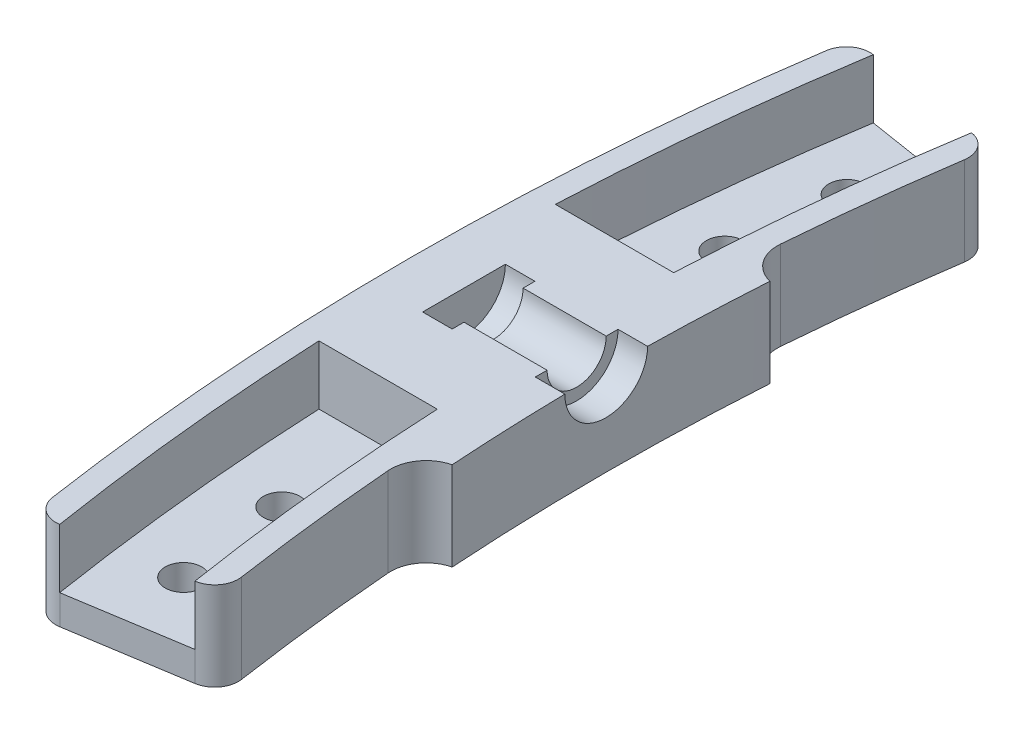
ISO-10303-21;
HEADER;
FILE_DESCRIPTION(('STEP AP214'),'2;1');
FILE_NAME('part.step','',(''),(''),'','','');
FILE_SCHEMA(('AUTOMOTIVE_DESIGN { 1 0 10303 214 1 1 1 1 }'));
ENDSEC;
DATA;
#1=APPLICATION_CONTEXT('core data for automotive mechanical design processes');
#2=APPLICATION_PROTOCOL_DEFINITION('international standard','automotive_design',2000,#1);
#3=PRODUCT_CONTEXT('',#1,'mechanical');
#4=PRODUCT('Part','Part','',(#3));
#5=PRODUCT_RELATED_PRODUCT_CATEGORY('part','',(#4));
#6=PRODUCT_DEFINITION_FORMATION('','',#4);
#7=PRODUCT_DEFINITION_CONTEXT('part definition',#1,'design');
#8=PRODUCT_DEFINITION('design','',#6,#7);
#9=PRODUCT_DEFINITION_SHAPE('','',#8);
#10=(LENGTH_UNIT() NAMED_UNIT(*) SI_UNIT(.MILLI.,.METRE.));
#11=(NAMED_UNIT(*) PLANE_ANGLE_UNIT() SI_UNIT($,.RADIAN.));
#12=(NAMED_UNIT(*) SI_UNIT($,.STERADIAN.) SOLID_ANGLE_UNIT());
#13=UNCERTAINTY_MEASURE_WITH_UNIT(LENGTH_MEASURE(1.E-05),#10,'distance_accuracy_value','');
#14=(GEOMETRIC_REPRESENTATION_CONTEXT(3) GLOBAL_UNCERTAINTY_ASSIGNED_CONTEXT((#13)) GLOBAL_UNIT_ASSIGNED_CONTEXT((#10,
#11,#12)) REPRESENTATION_CONTEXT('',''));
#15=CARTESIAN_POINT('',(0.,0.,0.));
#16=DIRECTION('',(0.,0.,1.));
#17=DIRECTION('',(1.,0.,0.));
#18=AXIS2_PLACEMENT_3D('',#15,#16,#17);
#19=CARTESIAN_POINT('',(0.,10.,0.));
#20=DIRECTION('',(0.,-1.,0.));
#21=DIRECTION('',(0.,0.,-1.));
#22=AXIS2_PLACEMENT_3D('',#19,#20,#21);
#23=CYLINDRICAL_SURFACE('',#22,208.);
#24=DIRECTION('',(0.,-1.,0.));
#25=VECTOR('',#24,1.);
#26=CARTESIAN_POINT('',(-207.337048968875,10.,-16.59361699204));
#27=LINE('',#26,#25);
#28=CARTESIAN_POINT('',(-207.337048968875,10.,-16.59361699204));
#29=VERTEX_POINT('',#28);
#30=CARTESIAN_POINT('',(-207.337048968875,2.5,-16.59361699204));
#31=VERTEX_POINT('',#30);
#32=EDGE_CURVE('E476',#29,#31,#27,.T.);
#33=ORIENTED_EDGE('',*,*,#32,.T.);
#34=CARTESIAN_POINT('',(0.,2.5,0.));
#35=DIRECTION('',(0.,1.,0.));
#36=DIRECTION('',(0.,0.,-1.));
#37=AXIS2_PLACEMENT_3D('',#34,#35,#36);
#38=CIRCLE('',#37,208.);
#39=CARTESIAN_POINT('',(-205.739746889114,2.5,-30.5803294619837));
#40=VERTEX_POINT('',#39);
#41=EDGE_CURVE('E378',#40,#31,#38,.T.);
#42=ORIENTED_EDGE('',*,*,#41,.F.);
#43=DIRECTION('',(0.,-1.,0.));
#44=VECTOR('',#43,1.);
#45=CARTESIAN_POINT('',(-205.739746889114,10.,-30.5803294619837));
#46=LINE('',#45,#44);
#47=CARTESIAN_POINT('',(-205.739746889114,10.,-30.5803294619837));
#48=VERTEX_POINT('',#47);
#49=EDGE_CURVE('E353',#40,#48,#46,.F.);
#50=ORIENTED_EDGE('',*,*,#49,.T.);
#51=CARTESIAN_POINT('',(0.,10.,0.));
#52=DIRECTION('',(0.,1.,0.));
#53=DIRECTION('',(0.,0.,1.));
#54=AXIS2_PLACEMENT_3D('',#51,#52,#53);
#55=CIRCLE('',#54,208.);
#56=EDGE_CURVE('E468',#48,#29,#55,.T.);
#57=ORIENTED_EDGE('',*,*,#56,.T.);
#58=EDGE_LOOP('',(#33,#42,#50,#57));
#59=FACE_BOUND('',#58,.T.);
#60=ADVANCED_FACE('F35',(#59),#23,.F.);
#61=DIRECTION('',(0.,-1.,0.));
#62=VECTOR('',#61,1.);
#63=CARTESIAN_POINT('',(-205.739746889114,10.,30.5803294619837));
#64=LINE('',#63,#62);
#65=CARTESIAN_POINT('',(-205.739746889114,10.,30.5803294619837));
#66=VERTEX_POINT('',#65);
#67=CARTESIAN_POINT('',(-205.739746889114,2.5,30.5803294619836));
#68=VERTEX_POINT('',#67);
#69=EDGE_CURVE('E351',#66,#68,#64,.T.);
#70=ORIENTED_EDGE('',*,*,#69,.T.);
#71=CARTESIAN_POINT('',(0.,2.5,0.));
#72=DIRECTION('',(0.,1.,0.));
#73=DIRECTION('',(0.,0.,-1.));
#74=AXIS2_PLACEMENT_3D('',#71,#72,#73);
#75=CIRCLE('',#74,208.);
#76=CARTESIAN_POINT('',(-207.337048968875,2.5,16.5936169920389));
#77=VERTEX_POINT('',#76);
#78=EDGE_CURVE('E363',#77,#68,#75,.T.);
#79=ORIENTED_EDGE('',*,*,#78,.F.);
#80=DIRECTION('',(0.,-1.,0.));
#81=VECTOR('',#80,1.);
#82=CARTESIAN_POINT('',(-207.337048968875,10.,16.5936169920387));
#83=LINE('',#82,#81);
#84=CARTESIAN_POINT('',(-207.337048968875,10.,16.5936169920387));
#85=VERTEX_POINT('',#84);
#86=EDGE_CURVE('E482',#77,#85,#83,.F.);
#87=ORIENTED_EDGE('',*,*,#86,.T.);
#88=EDGE_CURVE('E467',#85,#66,#55,.T.);
#89=ORIENTED_EDGE('',*,*,#88,.T.);
#90=EDGE_LOOP('',(#70,#79,#87,#89));
#91=FACE_BOUND('',#90,.T.);
#92=ADVANCED_FACE('F290',(#91),#23,.F.);
#93=CARTESIAN_POINT('',(0.,10.,0.));
#94=DIRECTION('',(0.156434465040234,0.,0.987688340595137));
#95=DIRECTION('',(0.987688340595137,0.,-0.156434465040234));
#96=AXIS2_PLACEMENT_3D('',#93,#94,#95);
#97=PLANE('',#96);
#98=DIRECTION('',(0.,1.,0.));
#99=VECTOR('',#98,1.);
#100=CARTESIAN_POINT('',(-217.282455760492,0.,34.414160147967));
#101=LINE('',#100,#99);
#102=CARTESIAN_POINT('',(-217.282455760492,5.,34.414160147967));
#103=VERTEX_POINT('',#102);
#104=CARTESIAN_POINT('',(-217.282455760492,2.5,34.414160147967));
#105=VERTEX_POINT('',#104);
#106=EDGE_CURVE('E338',#103,#105,#101,.F.);
#107=ORIENTED_EDGE('',*,*,#106,.T.);
#108=DIRECTION('',(-0.987688340595137,0.,0.156434465040233));
#109=VECTOR('',#108,1.);
#110=CARTESIAN_POINT('',(-207.405144756044,2.5,32.8497477726161));
#111=LINE('',#110,#109);
#112=CARTESIAN_POINT('',(-207.405144756044,2.5,32.8497477726161));
#113=VERTEX_POINT('',#112);
#114=EDGE_CURVE('E366',#113,#105,#111,.T.);
#115=ORIENTED_EDGE('',*,*,#114,.F.);
#116=DIRECTION('',(0.,-1.,0.));
#117=VECTOR('',#116,1.);
#118=CARTESIAN_POINT('',(-207.405144756044,10.,32.8497477726161));
#119=LINE('',#118,#117);
#120=CARTESIAN_POINT('',(-207.405144756044,10.,32.8497477726161));
#121=VERTEX_POINT('',#120);
#122=EDGE_CURVE('E331',#113,#121,#119,.F.);
#123=ORIENTED_EDGE('',*,*,#122,.T.);
#124=DIRECTION('',(-0.987688340595137,0.,0.156434465040234));
#125=VECTOR('',#124,1.);
#126=CARTESIAN_POINT('',(0.,10.,0.));
#127=LINE('',#126,#125);
#128=CARTESIAN_POINT('',(-207.414551524979,10.,32.8512376584491));
#129=VERTEX_POINT('',#128);
#130=EDGE_CURVE('E436',#121,#129,#127,.T.);
#131=ORIENTED_EDGE('',*,*,#130,.T.);
#132=DIRECTION('',(0.,1.,0.));
#133=VECTOR('',#132,1.);
#134=CARTESIAN_POINT('',(-207.414551524979,5.,32.8512376584491));
#135=LINE('',#134,#133);
#136=CARTESIAN_POINT('',(-207.414551524979,5.,32.8512376584491));
#137=VERTEX_POINT('',#136);
#138=EDGE_CURVE('E461',#137,#129,#135,.T.);
#139=ORIENTED_EDGE('',*,*,#138,.F.);
#140=DIRECTION('',(0.987688340595137,0.,-0.156434465040234));
#141=VECTOR('',#140,1.);
#142=CARTESIAN_POINT('',(0.,5.,0.));
#143=LINE('',#142,#141);
#144=EDGE_CURVE('E448',#103,#137,#143,.T.);
#145=ORIENTED_EDGE('',*,*,#144,.F.);
#146=EDGE_LOOP('',(#107,#115,#123,#131,#139,#145));
#147=FACE_BOUND('',#146,.T.);
#148=ADVANCED_FACE('F296',(#147),#97,.T.);
#149=CARTESIAN_POINT('',(0.,10.,0.));
#150=DIRECTION('',(0.156434465040234,0.,-0.987688340595137));
#151=DIRECTION('',(-0.987688340595137,0.,-0.156434465040234));
#152=AXIS2_PLACEMENT_3D('',#149,#150,#151);
#153=PLANE('',#152);
#154=DIRECTION('',(0.,-1.,0.));
#155=VECTOR('',#154,1.);
#156=CARTESIAN_POINT('',(-207.405144756044,10.,-32.8497477726161));
#157=LINE('',#156,#155);
#158=CARTESIAN_POINT('',(-207.405144756044,10.,-32.8497477726161));
#159=VERTEX_POINT('',#158);
#160=CARTESIAN_POINT('',(-207.405144756044,2.5,-32.8497477726161));
#161=VERTEX_POINT('',#160);
#162=EDGE_CURVE('E494',#159,#161,#157,.T.);
#163=ORIENTED_EDGE('',*,*,#162,.T.);
#164=DIRECTION('',(0.987688340595137,0.,0.156434465040233));
#165=VECTOR('',#164,1.);
#166=CARTESIAN_POINT('',(-217.282455760492,2.5,-34.414160147967));
#167=LINE('',#166,#165);
#168=CARTESIAN_POINT('',(-217.282455760492,2.5,-34.414160147967));
#169=VERTEX_POINT('',#168);
#170=EDGE_CURVE('E374',#169,#161,#167,.T.);
#171=ORIENTED_EDGE('',*,*,#170,.F.);
#172=DIRECTION('',(0.,1.,0.));
#173=VECTOR('',#172,1.);
#174=CARTESIAN_POINT('',(-217.282455760492,10.,-34.414160147967));
#175=LINE('',#174,#173);
#176=CARTESIAN_POINT('',(-217.282455760492,5.,-34.414160147967));
#177=VERTEX_POINT('',#176);
#178=EDGE_CURVE('E497',#169,#177,#175,.T.);
#179=ORIENTED_EDGE('',*,*,#178,.T.);
#180=DIRECTION('',(-0.987688340595137,0.,-0.156434465040234));
#181=VECTOR('',#180,1.);
#182=CARTESIAN_POINT('',(0.,5.,0.));
#183=LINE('',#182,#181);
#184=CARTESIAN_POINT('',(-207.414551524979,5.,-32.8512376584492));
#185=VERTEX_POINT('',#184);
#186=EDGE_CURVE('E413',#185,#177,#183,.T.);
#187=ORIENTED_EDGE('',*,*,#186,.F.);
#188=DIRECTION('',(0.,1.,0.));
#189=VECTOR('',#188,1.);
#190=CARTESIAN_POINT('',(-207.414551524979,5.,-32.8512376584492));
#191=LINE('',#190,#189);
#192=CARTESIAN_POINT('',(-207.414551524979,10.,-32.8512376584492));
#193=VERTEX_POINT('',#192);
#194=EDGE_CURVE('E433',#185,#193,#191,.T.);
#195=ORIENTED_EDGE('',*,*,#194,.T.);
#196=DIRECTION('',(0.987688340595137,0.,0.156434465040234));
#197=VECTOR('',#196,1.);
#198=CARTESIAN_POINT('',(0.,10.,0.));
#199=LINE('',#198,#197);
#200=EDGE_CURVE('E470',#193,#159,#199,.T.);
#201=ORIENTED_EDGE('',*,*,#200,.T.);
#202=EDGE_LOOP('',(#163,#171,#179,#187,#195,#201));
#203=FACE_BOUND('',#202,.T.);
#204=ADVANCED_FACE('F301',(#203),#153,.T.);
#205=CARTESIAN_POINT('',(0.,10.,0.));
#206=DIRECTION('',(0.,-1.,0.));
#207=DIRECTION('',(0.,0.,-1.));
#208=AXIS2_PLACEMENT_3D('',#205,#206,#207);
#209=CYLINDRICAL_SURFACE('',#208,222.);
#210=CARTESIAN_POINT('',(0.,2.5,0.));
#211=DIRECTION('',(0.,-1.,0.));
#212=DIRECTION('',(0.,0.,-1.));
#213=AXIS2_PLACEMENT_3D('',#210,#211,#212);
#214=CIRCLE('',#213,222.);
#215=CARTESIAN_POINT('',(-219.573464005941,2.5,32.7336814982929));
#216=VERTEX_POINT('',#215);
#217=CARTESIAN_POINT('',(-219.573464005941,2.5,-32.7336814982927));
#218=VERTEX_POINT('',#217);
#219=EDGE_CURVE('E370',#216,#218,#214,.T.);
#220=ORIENTED_EDGE('',*,*,#219,.F.);
#221=DIRECTION('',(0.,-1.,0.));
#222=VECTOR('',#221,1.);
#223=CARTESIAN_POINT('',(-219.573464005941,10.,32.7336814982928));
#224=LINE('',#223,#222);
#225=CARTESIAN_POINT('',(-219.573464005941,10.,32.7336814982929));
#226=VERTEX_POINT('',#225);
#227=EDGE_CURVE('E489',#216,#226,#224,.F.);
#228=ORIENTED_EDGE('',*,*,#227,.T.);
#229=CARTESIAN_POINT('',(0.,10.,0.));
#230=DIRECTION('',(0.,1.,0.));
#231=DIRECTION('',(0.,0.,1.));
#232=AXIS2_PLACEMENT_3D('',#229,#230,#231);
#233=CIRCLE('',#232,222.);
#234=CARTESIAN_POINT('',(-219.573464005941,10.,-32.7336814982929));
#235=VERTEX_POINT('',#234);
#236=EDGE_CURVE('E473',#235,#226,#233,.T.);
#237=ORIENTED_EDGE('',*,*,#236,.F.);
#238=DIRECTION('',(0.,-1.,0.));
#239=VECTOR('',#238,1.);
#240=CARTESIAN_POINT('',(-219.573464005941,10.,-32.7336814982928));
#241=LINE('',#240,#239);
#242=EDGE_CURVE('E491',#235,#218,#241,.T.);
#243=ORIENTED_EDGE('',*,*,#242,.T.);
#244=EDGE_LOOP('',(#220,#228,#237,#243));
#245=FACE_BOUND('',#244,.T.);
#246=ADVANCED_FACE('F537',(#245),#209,.T.);
#247=CARTESIAN_POINT('',(-213.160645195369,0.,-28.0631313273113));
#248=DIRECTION('',(0.,-1.,0.));
#249=DIRECTION('',(0.,0.,-1.));
#250=AXIS2_PLACEMENT_3D('',#247,#248,#249);
#251=CYLINDRICAL_SURFACE('',#250,1.55);
#252=CARTESIAN_POINT('',(-213.160645195369,5.,-28.0631313273113));
#253=DIRECTION('',(0.,1.,0.));
#254=DIRECTION('',(0.,0.,1.));
#255=AXIS2_PLACEMENT_3D('',#252,#253,#254);
#256=CIRCLE('',#255,1.55);
#257=CARTESIAN_POINT('',(-213.160645195369,5.,-26.5131313273113));
#258=VERTEX_POINT('',#257);
#259=EDGE_CURVE('E408',#258,#258,#256,.T.);
#260=ORIENTED_EDGE('',*,*,#259,.T.);
#261=EDGE_LOOP('',(#260));
#262=FACE_BOUND('',#261,.T.);
#263=CARTESIAN_POINT('',(-213.160645195369,2.5,-28.0631313273113));
#264=DIRECTION('',(0.,-1.,0.));
#265=DIRECTION('',(0.,0.,-1.));
#266=AXIS2_PLACEMENT_3D('',#263,#264,#265);
#267=CIRCLE('',#266,1.55);
#268=CARTESIAN_POINT('',(-213.160645195369,2.5,-29.6131313273113));
#269=VERTEX_POINT('',#268);
#270=EDGE_CURVE('E391',#269,#269,#267,.F.);
#271=ORIENTED_EDGE('',*,*,#270,.F.);
#272=EDGE_LOOP('',(#271));
#273=FACE_BOUND('',#272,.T.);
#274=ADVANCED_FACE('F539',(#262,#273),#251,.F.);
#275=CARTESIAN_POINT('',(-214.181860089725,0.,-18.7384846907465));
#276=DIRECTION('',(0.,-1.,0.));
#277=DIRECTION('',(0.,0.,-1.));
#278=AXIS2_PLACEMENT_3D('',#275,#276,#277);
#279=CYLINDRICAL_SURFACE('',#278,1.55);
#280=CARTESIAN_POINT('',(-214.181860089725,5.,-18.7384846907465));
#281=DIRECTION('',(0.,1.,0.));
#282=DIRECTION('',(0.,0.,1.));
#283=AXIS2_PLACEMENT_3D('',#280,#281,#282);
#284=CIRCLE('',#283,1.55);
#285=CARTESIAN_POINT('',(-214.181860089725,5.,-17.1884846907465));
#286=VERTEX_POINT('',#285);
#287=EDGE_CURVE('E405',#286,#286,#284,.T.);
#288=ORIENTED_EDGE('',*,*,#287,.T.);
#289=EDGE_LOOP('',(#288));
#290=FACE_BOUND('',#289,.T.);
#291=CARTESIAN_POINT('',(-214.181860089725,2.5,-18.7384846907465));
#292=DIRECTION('',(0.,-1.,0.));
#293=DIRECTION('',(0.,0.,-1.));
#294=AXIS2_PLACEMENT_3D('',#291,#292,#293);
#295=CIRCLE('',#294,1.55);
#296=CARTESIAN_POINT('',(-214.181860089725,2.5,-20.2884846907465));
#297=VERTEX_POINT('',#296);
#298=EDGE_CURVE('E388',#297,#297,#295,.F.);
#299=ORIENTED_EDGE('',*,*,#298,.F.);
#300=EDGE_LOOP('',(#299));
#301=FACE_BOUND('',#300,.T.);
#302=ADVANCED_FACE('F545',(#290,#301),#279,.F.);
#303=CARTESIAN_POINT('',(-214.181860089725,0.,18.7384846907466));
#304=DIRECTION('',(0.,-1.,0.));
#305=DIRECTION('',(0.,0.,-1.));
#306=AXIS2_PLACEMENT_3D('',#303,#304,#305);
#307=CYLINDRICAL_SURFACE('',#306,1.55);
#308=CARTESIAN_POINT('',(-214.181860089725,5.,18.7384846907466));
#309=DIRECTION('',(0.,1.,0.));
#310=DIRECTION('',(0.,0.,1.));
#311=AXIS2_PLACEMENT_3D('',#308,#309,#310);
#312=CIRCLE('',#311,1.55);
#313=CARTESIAN_POINT('',(-214.181860089725,5.,20.2884846907466));
#314=VERTEX_POINT('',#313);
#315=EDGE_CURVE('E409',#314,#314,#312,.T.);
#316=ORIENTED_EDGE('',*,*,#315,.T.);
#317=EDGE_LOOP('',(#316));
#318=FACE_BOUND('',#317,.T.);
#319=CARTESIAN_POINT('',(-214.181860089725,2.5,18.7384846907466));
#320=DIRECTION('',(0.,-1.,0.));
#321=DIRECTION('',(0.,0.,-1.));
#322=AXIS2_PLACEMENT_3D('',#319,#320,#321);
#323=CIRCLE('',#322,1.55);
#324=CARTESIAN_POINT('',(-214.181860089725,2.5,17.1884846907466));
#325=VERTEX_POINT('',#324);
#326=EDGE_CURVE('E385',#325,#325,#323,.F.);
#327=ORIENTED_EDGE('',*,*,#326,.F.);
#328=EDGE_LOOP('',(#327));
#329=FACE_BOUND('',#328,.T.);
#330=ADVANCED_FACE('F610',(#318,#329),#307,.F.);
#331=CARTESIAN_POINT('',(-213.160645195369,0.,28.0631313273113));
#332=DIRECTION('',(0.,-1.,0.));
#333=DIRECTION('',(0.,0.,-1.));
#334=AXIS2_PLACEMENT_3D('',#331,#332,#333);
#335=CYLINDRICAL_SURFACE('',#334,1.55);
#336=CARTESIAN_POINT('',(-213.160645195369,5.,28.0631313273113));
#337=DIRECTION('',(0.,1.,0.));
#338=DIRECTION('',(0.,0.,1.));
#339=AXIS2_PLACEMENT_3D('',#336,#337,#338);
#340=CIRCLE('',#339,1.55);
#341=CARTESIAN_POINT('',(-213.160645195369,5.,29.6131313273113));
#342=VERTEX_POINT('',#341);
#343=EDGE_CURVE('E404',#342,#342,#340,.T.);
#344=ORIENTED_EDGE('',*,*,#343,.T.);
#345=EDGE_LOOP('',(#344));
#346=FACE_BOUND('',#345,.T.);
#347=CARTESIAN_POINT('',(-213.160645195369,2.5,28.0631313273113));
#348=DIRECTION('',(0.,-1.,0.));
#349=DIRECTION('',(0.,0.,-1.));
#350=AXIS2_PLACEMENT_3D('',#347,#348,#349);
#351=CIRCLE('',#350,1.55);
#352=CARTESIAN_POINT('',(-213.160645195369,2.5,26.5131313273113));
#353=VERTEX_POINT('',#352);
#354=EDGE_CURVE('E382',#353,#353,#351,.F.);
#355=ORIENTED_EDGE('',*,*,#354,.F.);
#356=EDGE_LOOP('',(#355));
#357=FACE_BOUND('',#356,.T.);
#358=ADVANCED_FACE('F613',(#346,#357),#335,.F.);
#359=CARTESIAN_POINT('',(0.,10.,0.));
#360=DIRECTION('',(0.,-1.,0.));
#361=DIRECTION('',(0.,0.,-1.));
#362=AXIS2_PLACEMENT_3D('',#359,#360,#361);
#363=CYLINDRICAL_SURFACE('',#362,205.5);
#364=CARTESIAN_POINT('',(0.,10.,0.));
#365=DIRECTION('',(0.,-1.,0.));
#366=DIRECTION('',(0.,0.,1.));
#367=AXIS2_PLACEMENT_3D('',#364,#365,#366);
#368=CIRCLE('',#367,205.5);
#369=CARTESIAN_POINT('',(-205.470192485431,10.,-3.5));
#370=VERTEX_POINT('',#369);
#371=CARTESIAN_POINT('',(-205.060008725533,10.,-13.4403430567945));
#372=VERTEX_POINT('',#371);
#373=EDGE_CURVE('E394',#370,#372,#368,.T.);
#374=ORIENTED_EDGE('',*,*,#373,.F.);
#375=CARTESIAN_POINT('',(-205.470192485431,10.,-3.5));
#376=CARTESIAN_POINT('',(-205.47019179769,9.90156701657166,-3.50000943872721));
#377=CARTESIAN_POINT('',(-205.470263204359,9.8031385160035,-3.49584758310926));
#378=CARTESIAN_POINT('',(-205.470545128519,9.6069858485222,-3.47925433272638));
#379=CARTESIAN_POINT('',(-205.470755639276,9.50926164773979,-3.4668233383371));
#380=CARTESIAN_POINT('',(-205.471310497863,9.3152720418903,-3.43377656011316));
#381=CARTESIAN_POINT('',(-205.471654750745,9.21900565213266,-3.41316658261365));
#382=CARTESIAN_POINT('',(-205.472466722473,9.02857505100702,-3.36392915285146));
#383=CARTESIAN_POINT('',(-205.472934439833,8.93441081434749,-3.33530179710406));
#384=CARTESIAN_POINT('',(-205.474504712896,8.65598338556596,-3.23762631417777));
#385=CARTESIAN_POINT('',(-205.475774642457,8.47570279913906,-3.15677061178356));
#386=CARTESIAN_POINT('',(-205.478616597242,8.13141074648071,-2.96600012431516));
#387=CARTESIAN_POINT('',(-205.480188563762,7.96739612813587,-2.85609098457522));
#388=CARTESIAN_POINT('',(-205.483458007803,7.66009847995335,-2.61027861440496));
#389=CARTESIAN_POINT('',(-205.485155499411,7.5168177821179,-2.47437246400309));
#390=CARTESIAN_POINT('',(-205.488484701828,7.2550907618946,-2.18041643899056));
#391=CARTESIAN_POINT('',(-205.490116402581,7.13664822463133,-2.02236319546442));
#392=CARTESIAN_POINT('',(-205.493129830823,6.92797608819844,-1.68860911001838));
#393=CARTESIAN_POINT('',(-205.494511554147,6.83774695910754,-1.51290797412191));
#394=CARTESIAN_POINT('',(-205.496869123008,6.68807425910168,-1.14886006638418));
#395=CARTESIAN_POINT('',(-205.49784499475,6.62862870053265,-0.960514111889293));
#396=CARTESIAN_POINT('',(-205.499280908388,6.54220585728777,-0.576528295989678));
#397=CARTESIAN_POINT('',(-205.499740990452,6.51522604419833,-0.380889003809499));
#398=CARTESIAN_POINT('',(-205.50009359534,6.49449287787381,0.0121472898899605));
#399=CARTESIAN_POINT('',(-205.499986105514,6.50074026511635,0.209544330483296));
#400=CARTESIAN_POINT('',(-205.499215701122,6.5462829842424,0.600464500041598));
#401=CARTESIAN_POINT('',(-205.498552849708,6.58557455855856,0.793988066910932));
#402=CARTESIAN_POINT('',(-205.496746522394,6.69608442895505,1.17169096079018));
#403=CARTESIAN_POINT('',(-205.495603047853,6.76730263481943,1.35587031420264));
#404=CARTESIAN_POINT('',(-205.492964243791,6.93965005625289,1.70967296030795));
#405=CARTESIAN_POINT('',(-205.49146888652,7.0407816311497,1.87929510348229));
#406=CARTESIAN_POINT('',(-205.488294988736,7.2700782815406,2.19914639630217));
#407=CARTESIAN_POINT('',(-205.486616457068,7.39824205222416,2.34937648141426));
#408=CARTESIAN_POINT('',(-205.483265329395,7.67796514344098,2.62619026217674));
#409=CARTESIAN_POINT('',(-205.481592733349,7.82952429621001,2.75277412737568));
#410=CARTESIAN_POINT('',(-205.478441487921,8.15180339666952,2.97874163067494));
#411=CARTESIAN_POINT('',(-205.476962900275,8.32252941163064,3.07811662137887));
#412=CARTESIAN_POINT('',(-205.474366236861,8.67831744280354,3.24684033187834));
#413=CARTESIAN_POINT('',(-205.473248381718,8.8633881468086,3.31617068510003));
#414=CARTESIAN_POINT('',(-205.471502206916,9.24240058207589,3.42266927120822));
#415=CARTESIAN_POINT('',(-205.470873139885,9.43632828802802,3.45988661554046));
#416=CARTESIAN_POINT('',(-205.470412654252,9.69295529264849,3.48705255884532));
#417=CARTESIAN_POINT('',(-205.470330133082,9.75431769754783,3.49191041060893));
#418=CARTESIAN_POINT('',(-205.470220122299,9.87711178029478,3.49837969921849));
#419=CARTESIAN_POINT('',(-205.4701925419,9.9385431757505,3.49999649168429));
#420=CARTESIAN_POINT('',(-205.470192485431,10.,3.5));
#421=B_SPLINE_CURVE_WITH_KNOTS('',3,(#375,#376,#377,#378,#379,#380,#381,#382,#383,#384,#385,
#386,#387,#388,#389,#390,#391,#392,#393,#394,#395,#396,#397,#398,#399,#400,#401,#402,#403,#404,
#405,#406,#407,#408,#409,#410,#411,#412,#413,#414,#415,#416,#417,#418,#419,#420),.UNSPECIFIED.,
.F.,.F.,(4,2,2,2,2,2,2,2,2,2,2,2,2,2,2,2,2,2,2,2,2,2,4),(0.,0.295202888349667,0.59039148458865,
0.885370897536079,1.18034675959726,1.77005001476589,2.35963876961009,2.94929378570087,
3.53903859501011,4.12879322985059,4.7185097802719,5.30818040093464,5.89786416263023,
6.48748087843679,7.07709592815794,7.66675749441302,8.25639060494739,8.84601948752166,
9.435835546226,10.0260116582365,10.6152835872415,10.7998872395626,10.9841855952015),.UNSPECIFIED.);
#422=CARTESIAN_POINT('',(-205.470192485431,10.,3.5));
#423=VERTEX_POINT('',#422);
#424=EDGE_CURVE('E243',#370,#423,#421,.T.);
#425=ORIENTED_EDGE('',*,*,#424,.T.);
#426=CARTESIAN_POINT('',(-205.060008725533,10.,13.4403430567945));
#427=VERTEX_POINT('',#426);
#428=EDGE_CURVE('E395',#427,#423,#368,.T.);
#429=ORIENTED_EDGE('',*,*,#428,.F.);
#430=DIRECTION('',(0.,-1.,0.));
#431=VECTOR('',#430,1.);
#432=CARTESIAN_POINT('',(-205.060008725533,10.,13.4403430567945));
#433=LINE('',#432,#431);
#434=CARTESIAN_POINT('',(-205.060008725533,2.5,13.4403430567946));
#435=VERTEX_POINT('',#434);
#436=EDGE_CURVE('E398',#427,#435,#433,.T.);
#437=ORIENTED_EDGE('',*,*,#436,.T.);
#438=CARTESIAN_POINT('',(0.,2.5,0.));
#439=DIRECTION('',(0.,1.,0.));
#440=DIRECTION('',(0.,0.,-1.));
#441=AXIS2_PLACEMENT_3D('',#438,#439,#440);
#442=CIRCLE('',#441,205.5);
#443=CARTESIAN_POINT('',(-205.060008725533,2.5,-13.4403430567952));
#444=VERTEX_POINT('',#443);
#445=EDGE_CURVE('E358',#444,#435,#442,.T.);
#446=ORIENTED_EDGE('',*,*,#445,.F.);
#447=DIRECTION('',(0.,-1.,0.));
#448=VECTOR('',#447,1.);
#449=CARTESIAN_POINT('',(-205.060008725533,10.,-13.4403430567945));
#450=LINE('',#449,#448);
#451=EDGE_CURVE('E401',#372,#444,#450,.T.);
#452=ORIENTED_EDGE('',*,*,#451,.F.);
#453=EDGE_LOOP('',(#374,#425,#429,#437,#446,#452));
#454=FACE_BOUND('',#453,.T.);
#455=ADVANCED_FACE('F259',(#454),#363,.F.);
#456=CARTESIAN_POINT('',(-204.346610762593,10.,-16.3542859777317));
#457=DIRECTION('',(0.,-1.,0.));
#458=DIRECTION('',(0.,0.,-1.));
#459=AXIS2_PLACEMENT_3D('',#456,#457,#458);
#460=CYLINDRICAL_SURFACE('',#459,3.);
#461=CARTESIAN_POINT('',(-204.346610762593,2.5,-16.3542859777317));
#462=DIRECTION('',(0.,1.,0.));
#463=DIRECTION('',(0.,0.,-1.));
#464=AXIS2_PLACEMENT_3D('',#461,#462,#463);
#465=CIRCLE('',#464,3.00000000000047);
#466=EDGE_CURVE('E380',#31,#444,#465,.T.);
#467=ORIENTED_EDGE('',*,*,#466,.F.);
#468=ORIENTED_EDGE('',*,*,#32,.F.);
#469=CARTESIAN_POINT('',(-204.346610762593,10.,-16.3542859777317));
#470=DIRECTION('',(0.,1.,0.));
#471=DIRECTION('',(0.,0.,1.));
#472=AXIS2_PLACEMENT_3D('',#469,#470,#471);
#473=CIRCLE('',#472,3.);
#474=EDGE_CURVE('E484',#372,#29,#473,.F.);
#475=ORIENTED_EDGE('',*,*,#474,.F.);
#476=ORIENTED_EDGE('',*,*,#451,.T.);
#477=EDGE_LOOP('',(#467,#468,#475,#476));
#478=FACE_BOUND('',#477,.T.);
#479=ADVANCED_FACE('F306',(#478),#460,.F.);
#480=CARTESIAN_POINT('',(-204.346610762593,10.,16.3542859777305));
#481=DIRECTION('',(0.,-1.,0.));
#482=DIRECTION('',(0.,0.,-1.));
#483=AXIS2_PLACEMENT_3D('',#480,#481,#482);
#484=CYLINDRICAL_SURFACE('',#483,3.);
#485=CARTESIAN_POINT('',(-204.346610762593,2.5,16.3542859777305));
#486=DIRECTION('',(0.,1.,0.));
#487=DIRECTION('',(0.,0.,-1.));
#488=AXIS2_PLACEMENT_3D('',#485,#486,#487);
#489=CIRCLE('',#488,2.99999999999999);
#490=EDGE_CURVE('E359',#435,#77,#489,.T.);
#491=ORIENTED_EDGE('',*,*,#490,.F.);
#492=ORIENTED_EDGE('',*,*,#436,.F.);
#493=CARTESIAN_POINT('',(-204.346610762593,10.,16.3542859777305));
#494=DIRECTION('',(0.,1.,0.));
#495=DIRECTION('',(0.,0.,1.));
#496=AXIS2_PLACEMENT_3D('',#493,#494,#495);
#497=CIRCLE('',#496,3.);
#498=EDGE_CURVE('E487',#85,#427,#497,.F.);
#499=ORIENTED_EDGE('',*,*,#498,.F.);
#500=ORIENTED_EDGE('',*,*,#86,.F.);
#501=EDGE_LOOP('',(#491,#492,#499,#500));
#502=FACE_BOUND('',#501,.T.);
#503=ADVANCED_FACE('F309',(#502),#484,.F.);
#504=CARTESIAN_POINT('',(-217.595324690572,10.,-32.4387834667767));
#505=DIRECTION('',(0.,-1.,0.));
#506=DIRECTION('',(0.,0.,-1.));
#507=AXIS2_PLACEMENT_3D('',#504,#505,#506);
#508=CYLINDRICAL_SURFACE('',#507,2.);
#509=ORIENTED_EDGE('',*,*,#178,.F.);
#510=CARTESIAN_POINT('',(-217.595324690572,2.5,-32.4387834667767));
#511=DIRECTION('',(0.,-1.,0.));
#512=DIRECTION('',(0.,0.,-1.));
#513=AXIS2_PLACEMENT_3D('',#510,#511,#512);
#514=CIRCLE('',#513,2.);
#515=EDGE_CURVE('E372',#218,#169,#514,.T.);
#516=ORIENTED_EDGE('',*,*,#515,.F.);
#517=ORIENTED_EDGE('',*,*,#242,.F.);
#518=CARTESIAN_POINT('',(-217.595324690572,10.,-32.4387834667767));
#519=DIRECTION('',(0.,1.,0.));
#520=DIRECTION('',(0.,0.,1.));
#521=AXIS2_PLACEMENT_3D('',#518,#519,#520);
#522=CIRCLE('',#521,2.);
#523=CARTESIAN_POINT('',(-217.291438163197,10.,-34.4155619011182));
#524=VERTEX_POINT('',#523);
#525=EDGE_CURVE('E339',#524,#235,#522,.T.);
#526=ORIENTED_EDGE('',*,*,#525,.F.);
#527=DIRECTION('',(0.,1.,0.));
#528=VECTOR('',#527,1.);
#529=CARTESIAN_POINT('',(-217.291438163197,5.,-34.4155619011187));
#530=LINE('',#529,#528);
#531=CARTESIAN_POINT('',(-217.291438163197,5.,-34.4155619011187));
#532=VERTEX_POINT('',#531);
#533=EDGE_CURVE('E501',#532,#524,#530,.T.);
#534=ORIENTED_EDGE('',*,*,#533,.F.);
#535=CARTESIAN_POINT('',(-217.595324690572,5.,-32.4387834667767));
#536=DIRECTION('',(0.,1.,0.));
#537=DIRECTION('',(0.,0.,1.));
#538=AXIS2_PLACEMENT_3D('',#535,#536,#537);
#539=CIRCLE('',#538,2.);
#540=EDGE_CURVE('E499',#177,#532,#539,.T.);
#541=ORIENTED_EDGE('',*,*,#540,.F.);
#542=EDGE_LOOP('',(#509,#516,#517,#526,#534,#541));
#543=FACE_BOUND('',#542,.T.);
#544=ADVANCED_FACE('F313',(#543),#508,.T.);
#545=CARTESIAN_POINT('',(-217.595324690572,10.,32.4387834667767));
#546=DIRECTION('',(0.,-1.,0.));
#547=DIRECTION('',(0.,0.,-1.));
#548=AXIS2_PLACEMENT_3D('',#545,#546,#547);
#549=CYLINDRICAL_SURFACE('',#548,2.);
#550=ORIENTED_EDGE('',*,*,#227,.F.);
#551=CARTESIAN_POINT('',(-217.595324690572,2.5,32.4387834667767));
#552=DIRECTION('',(0.,-1.,0.));
#553=DIRECTION('',(0.,0.,-1.));
#554=AXIS2_PLACEMENT_3D('',#551,#552,#553);
#555=CIRCLE('',#554,2.);
#556=EDGE_CURVE('E368',#105,#216,#555,.T.);
#557=ORIENTED_EDGE('',*,*,#556,.F.);
#558=ORIENTED_EDGE('',*,*,#106,.F.);
#559=CARTESIAN_POINT('',(-217.595324690572,5.,32.4387834667767));
#560=DIRECTION('',(0.,1.,0.));
#561=DIRECTION('',(0.,0.,1.));
#562=AXIS2_PLACEMENT_3D('',#559,#560,#561);
#563=CIRCLE('',#562,2.);
#564=CARTESIAN_POINT('',(-217.291438163197,5.,34.4155619011182));
#565=VERTEX_POINT('',#564);
#566=EDGE_CURVE('E349',#565,#103,#563,.T.);
#567=ORIENTED_EDGE('',*,*,#566,.F.);
#568=DIRECTION('',(0.,1.,0.));
#569=VECTOR('',#568,1.);
#570=CARTESIAN_POINT('',(-217.291438163197,10.,34.4155619011187));
#571=LINE('',#570,#569);
#572=CARTESIAN_POINT('',(-217.291438163197,10.,34.4155619011187));
#573=VERTEX_POINT('',#572);
#574=EDGE_CURVE('E342',#573,#565,#571,.F.);
#575=ORIENTED_EDGE('',*,*,#574,.F.);
#576=CARTESIAN_POINT('',(-217.595324690572,10.,32.4387834667767));
#577=DIRECTION('',(0.,1.,0.));
#578=DIRECTION('',(0.,0.,1.));
#579=AXIS2_PLACEMENT_3D('',#576,#577,#578);
#580=CIRCLE('',#579,2.);
#581=EDGE_CURVE('E344',#226,#573,#580,.T.);
#582=ORIENTED_EDGE('',*,*,#581,.F.);
#583=EDGE_LOOP('',(#550,#557,#558,#567,#575,#582));
#584=FACE_BOUND('',#583,.T.);
#585=ADVANCED_FACE('F317',(#584),#549,.T.);
#586=CARTESIAN_POINT('',(-207.718013686124,10.,30.8743710914258));
#587=DIRECTION('',(0.,-1.,0.));
#588=DIRECTION('',(0.,0.,-1.));
#589=AXIS2_PLACEMENT_3D('',#586,#587,#588);
#590=CYLINDRICAL_SURFACE('',#589,2.);
#591=ORIENTED_EDGE('',*,*,#122,.F.);
#592=CARTESIAN_POINT('',(-207.718013686124,2.5,30.8743710914258));
#593=DIRECTION('',(0.,-1.,0.));
#594=DIRECTION('',(0.,0.,-1.));
#595=AXIS2_PLACEMENT_3D('',#592,#593,#594);
#596=CIRCLE('',#595,2.00000000000001);
#597=EDGE_CURVE('E333',#68,#113,#596,.T.);
#598=ORIENTED_EDGE('',*,*,#597,.F.);
#599=ORIENTED_EDGE('',*,*,#69,.F.);
#600=CARTESIAN_POINT('',(-207.718013686124,10.,30.8743710914258));
#601=DIRECTION('',(0.,1.,0.));
#602=DIRECTION('',(0.,0.,1.));
#603=AXIS2_PLACEMENT_3D('',#600,#601,#602);
#604=CIRCLE('',#603,2.);
#605=EDGE_CURVE('E335',#121,#66,#604,.T.);
#606=ORIENTED_EDGE('',*,*,#605,.F.);
#607=EDGE_LOOP('',(#591,#598,#599,#606));
#608=FACE_BOUND('',#607,.T.);
#609=ADVANCED_FACE('F320',(#608),#590,.T.);
#610=CARTESIAN_POINT('',(-207.718013686124,10.,-30.8743710914258));
#611=DIRECTION('',(0.,-1.,0.));
#612=DIRECTION('',(0.,0.,-1.));
#613=AXIS2_PLACEMENT_3D('',#610,#611,#612);
#614=CYLINDRICAL_SURFACE('',#613,2.);
#615=ORIENTED_EDGE('',*,*,#49,.F.);
#616=CARTESIAN_POINT('',(-207.718013686124,2.5,-30.8743710914258));
#617=DIRECTION('',(0.,-1.,0.));
#618=DIRECTION('',(0.,0.,-1.));
#619=AXIS2_PLACEMENT_3D('',#616,#617,#618);
#620=CIRCLE('',#619,2.);
#621=EDGE_CURVE('E376',#161,#40,#620,.T.);
#622=ORIENTED_EDGE('',*,*,#621,.F.);
#623=ORIENTED_EDGE('',*,*,#162,.F.);
#624=CARTESIAN_POINT('',(-207.718013686124,10.,-30.8743710914258));
#625=DIRECTION('',(0.,1.,0.));
#626=DIRECTION('',(0.,0.,1.));
#627=AXIS2_PLACEMENT_3D('',#624,#625,#626);
#628=CIRCLE('',#627,2.);
#629=EDGE_CURVE('E503',#48,#159,#628,.T.);
#630=ORIENTED_EDGE('',*,*,#629,.F.);
#631=EDGE_LOOP('',(#615,#622,#623,#630));
#632=FACE_BOUND('',#631,.T.);
#633=ADVANCED_FACE('F37',(#632),#614,.T.);
#634=CARTESIAN_POINT('',(0.,10.,0.));
#635=DIRECTION('',(0.,1.,0.));
#636=DIRECTION('',(0.,0.,1.));
#637=AXIS2_PLACEMENT_3D('',#634,#635,#636);
#638=PLANE('',#637);
#639=DIRECTION('',(1.,0.,0.));
#640=VECTOR('',#639,1.);
#641=CARTESIAN_POINT('',(-222.071067811865,10.,2.5));
#642=LINE('',#641,#640);
#643=CARTESIAN_POINT('',(-215.,10.,2.5));
#644=VERTEX_POINT('',#643);
#645=CARTESIAN_POINT('',(-207.970192485431,10.,2.5));
#646=VERTEX_POINT('',#645);
#647=EDGE_CURVE('E50',#644,#646,#642,.T.);
#648=ORIENTED_EDGE('',*,*,#647,.F.);
#649=DIRECTION('',(0.,0.,-1.));
#650=VECTOR('',#649,1.);
#651=CARTESIAN_POINT('',(-215.,10.,0.));
#652=LINE('',#651,#650);
#653=CARTESIAN_POINT('',(-215.,10.,3.50000000000002));
#654=VERTEX_POINT('',#653);
#655=EDGE_CURVE('E222',#654,#644,#652,.T.);
#656=ORIENTED_EDGE('',*,*,#655,.F.);
#657=DIRECTION('',(-1.,0.,0.));
#658=VECTOR('',#657,1.);
#659=CARTESIAN_POINT('',(-215.,10.,3.50000000000002));
#660=LINE('',#659,#658);
#661=CARTESIAN_POINT('',(-217.5,10.,3.50000000000002));
#662=VERTEX_POINT('',#661);
#663=EDGE_CURVE('E231',#654,#662,#660,.T.);
#664=ORIENTED_EDGE('',*,*,#663,.T.);
#665=DIRECTION('',(0.,0.,-1.));
#666=VECTOR('',#665,1.);
#667=CARTESIAN_POINT('',(-217.5,10.,0.));
#668=LINE('',#667,#666);
#669=CARTESIAN_POINT('',(-217.5,10.,-3.49999999999998));
#670=VERTEX_POINT('',#669);
#671=EDGE_CURVE('E355',#662,#670,#668,.T.);
#672=ORIENTED_EDGE('',*,*,#671,.T.);
#673=DIRECTION('',(-1.,0.,0.));
#674=VECTOR('',#673,1.);
#675=CARTESIAN_POINT('',(-215.,10.,-3.49999999999998));
#676=LINE('',#675,#674);
#677=CARTESIAN_POINT('',(-215.,10.,-3.49999999999998));
#678=VERTEX_POINT('',#677);
#679=EDGE_CURVE('E228',#670,#678,#676,.F.);
#680=ORIENTED_EDGE('',*,*,#679,.T.);
#681=CARTESIAN_POINT('',(-215.,10.,-2.5));
#682=VERTEX_POINT('',#681);
#683=EDGE_CURVE('E219',#682,#678,#652,.T.);
#684=ORIENTED_EDGE('',*,*,#683,.F.);
#685=DIRECTION('',(1.,0.,0.));
#686=VECTOR('',#685,1.);
#687=CARTESIAN_POINT('',(-222.071067811865,10.,-2.5));
#688=LINE('',#687,#686);
#689=CARTESIAN_POINT('',(-207.970192485431,10.,-2.5));
#690=VERTEX_POINT('',#689);
#691=EDGE_CURVE('E206',#690,#682,#688,.F.);
#692=ORIENTED_EDGE('',*,*,#691,.F.);
#693=DIRECTION('',(0.,0.,1.));
#694=VECTOR('',#693,1.);
#695=CARTESIAN_POINT('',(-207.970192485431,10.,0.));
#696=LINE('',#695,#694);
#697=CARTESIAN_POINT('',(-207.970192485431,10.,-3.5));
#698=VERTEX_POINT('',#697);
#699=EDGE_CURVE('E236',#698,#690,#696,.T.);
#700=ORIENTED_EDGE('',*,*,#699,.F.);
#701=DIRECTION('',(-1.,0.,0.));
#702=VECTOR('',#701,1.);
#703=CARTESIAN_POINT('',(-217.5,10.,-3.5));
#704=LINE('',#703,#702);
#705=EDGE_CURVE('E43',#370,#698,#704,.T.);
#706=ORIENTED_EDGE('',*,*,#705,.F.);
#707=ORIENTED_EDGE('',*,*,#373,.T.);
#708=ORIENTED_EDGE('',*,*,#474,.T.);
#709=ORIENTED_EDGE('',*,*,#56,.F.);
#710=ORIENTED_EDGE('',*,*,#629,.T.);
#711=ORIENTED_EDGE('',*,*,#200,.F.);
#712=CARTESIAN_POINT('',(0.,10.,0.));
#713=DIRECTION('',(0.,1.,0.));
#714=DIRECTION('',(0.,0.,1.));
#715=AXIS2_PLACEMENT_3D('',#712,#713,#714);
#716=CIRCLE('',#715,210.);
#717=CARTESIAN_POINT('',(-209.76176963403,10.,-9.99999999999997));
#718=VERTEX_POINT('',#717);
#719=EDGE_CURVE('E417',#193,#718,#716,.T.);
#720=ORIENTED_EDGE('',*,*,#719,.T.);
#721=DIRECTION('',(-1.,0.,0.));
#722=VECTOR('',#721,1.);
#723=CARTESIAN_POINT('',(0.,10.,-9.99999999999997));
#724=LINE('',#723,#722);
#725=CARTESIAN_POINT('',(-219.772609758359,10.,-9.99999999999997));
#726=VERTEX_POINT('',#725);
#727=EDGE_CURVE('E427',#718,#726,#724,.T.);
#728=ORIENTED_EDGE('',*,*,#727,.T.);
#729=CARTESIAN_POINT('',(0.,10.,0.));
#730=DIRECTION('',(0.,1.,0.));
#731=DIRECTION('',(0.,0.,1.));
#732=AXIS2_PLACEMENT_3D('',#729,#730,#731);
#733=CIRCLE('',#732,220.);
#734=EDGE_CURVE('E425',#524,#726,#733,.T.);
#735=ORIENTED_EDGE('',*,*,#734,.F.);
#736=ORIENTED_EDGE('',*,*,#525,.T.);
#737=ORIENTED_EDGE('',*,*,#236,.T.);
#738=ORIENTED_EDGE('',*,*,#581,.T.);
#739=CARTESIAN_POINT('',(0.,10.,0.));
#740=DIRECTION('',(0.,1.,0.));
#741=DIRECTION('',(0.,0.,1.));
#742=AXIS2_PLACEMENT_3D('',#739,#740,#741);
#743=CIRCLE('',#742,220.);
#744=CARTESIAN_POINT('',(-219.772609758359,10.,10.));
#745=VERTEX_POINT('',#744);
#746=EDGE_CURVE('E455',#745,#573,#743,.T.);
#747=ORIENTED_EDGE('',*,*,#746,.F.);
#748=DIRECTION('',(-1.,0.,0.));
#749=VECTOR('',#748,1.);
#750=CARTESIAN_POINT('',(0.,10.,10.));
#751=LINE('',#750,#749);
#752=CARTESIAN_POINT('',(-209.76176963403,10.,10.));
#753=VERTEX_POINT('',#752);
#754=EDGE_CURVE('E412',#753,#745,#751,.T.);
#755=ORIENTED_EDGE('',*,*,#754,.F.);
#756=CARTESIAN_POINT('',(0.,10.,0.));
#757=DIRECTION('',(0.,1.,0.));
#758=DIRECTION('',(0.,0.,1.));
#759=AXIS2_PLACEMENT_3D('',#756,#757,#758);
#760=CIRCLE('',#759,210.);
#761=EDGE_CURVE('E445',#753,#129,#760,.T.);
#762=ORIENTED_EDGE('',*,*,#761,.T.);
#763=ORIENTED_EDGE('',*,*,#130,.F.);
#764=ORIENTED_EDGE('',*,*,#605,.T.);
#765=ORIENTED_EDGE('',*,*,#88,.F.);
#766=ORIENTED_EDGE('',*,*,#498,.T.);
#767=ORIENTED_EDGE('',*,*,#428,.T.);
#768=DIRECTION('',(-1.,0.,0.));
#769=VECTOR('',#768,1.);
#770=CARTESIAN_POINT('',(-217.5,10.,3.5));
#771=LINE('',#770,#769);
#772=CARTESIAN_POINT('',(-207.970192485431,10.,3.5));
#773=VERTEX_POINT('',#772);
#774=EDGE_CURVE('E230',#773,#423,#771,.F.);
#775=ORIENTED_EDGE('',*,*,#774,.F.);
#776=EDGE_CURVE('E56',#646,#773,#696,.T.);
#777=ORIENTED_EDGE('',*,*,#776,.F.);
#778=EDGE_LOOP('',(#648,#656,#664,#672,#680,#684,#692,#700,#706,#707,#708,#709,#710,#711,#720,
#728,#735,#736,#737,#738,#747,#755,#762,#763,#764,#765,#766,#767,#775,#777));
#779=FACE_BOUND('',#778,.T.);
#780=ADVANCED_FACE('F225',(#779),#638,.T.);
#781=CARTESIAN_POINT('',(0.,5.,10.));
#782=DIRECTION('',(0.,0.,-1.));
#783=DIRECTION('',(-1.,0.,0.));
#784=AXIS2_PLACEMENT_3D('',#781,#782,#783);
#785=PLANE('',#784);
#786=ORIENTED_EDGE('',*,*,#754,.T.);
#787=DIRECTION('',(0.,1.,0.));
#788=VECTOR('',#787,1.);
#789=CARTESIAN_POINT('',(-219.772609758359,5.,10.));
#790=LINE('',#789,#788);
#791=CARTESIAN_POINT('',(-219.772609758359,5.,10.));
#792=VERTEX_POINT('',#791);
#793=EDGE_CURVE('E453',#792,#745,#790,.T.);
#794=ORIENTED_EDGE('',*,*,#793,.F.);
#795=DIRECTION('',(-1.,0.,0.));
#796=VECTOR('',#795,1.);
#797=CARTESIAN_POINT('',(0.,5.,10.));
#798=LINE('',#797,#796);
#799=CARTESIAN_POINT('',(-209.76176963403,5.,10.));
#800=VERTEX_POINT('',#799);
#801=EDGE_CURVE('E441',#800,#792,#798,.T.);
#802=ORIENTED_EDGE('',*,*,#801,.F.);
#803=DIRECTION('',(0.,1.,0.));
#804=VECTOR('',#803,1.);
#805=CARTESIAN_POINT('',(-209.76176963403,5.,10.));
#806=LINE('',#805,#804);
#807=EDGE_CURVE('E428',#800,#753,#806,.T.);
#808=ORIENTED_EDGE('',*,*,#807,.T.);
#809=EDGE_LOOP('',(#786,#794,#802,#808));
#810=FACE_BOUND('',#809,.T.);
#811=ADVANCED_FACE('F526',(#810),#785,.F.);
#812=CARTESIAN_POINT('',(0.,5.,0.));
#813=DIRECTION('',(0.,1.,0.));
#814=DIRECTION('',(0.,0.,1.));
#815=AXIS2_PLACEMENT_3D('',#812,#813,#814);
#816=CYLINDRICAL_SURFACE('',#815,210.);
#817=ORIENTED_EDGE('',*,*,#761,.F.);
#818=ORIENTED_EDGE('',*,*,#807,.F.);
#819=CARTESIAN_POINT('',(0.,5.,0.));
#820=DIRECTION('',(0.,1.,0.));
#821=DIRECTION('',(0.,0.,1.));
#822=AXIS2_PLACEMENT_3D('',#819,#820,#821);
#823=CIRCLE('',#822,210.);
#824=EDGE_CURVE('E450',#800,#137,#823,.T.);
#825=ORIENTED_EDGE('',*,*,#824,.T.);
#826=ORIENTED_EDGE('',*,*,#138,.T.);
#827=EDGE_LOOP('',(#817,#818,#825,#826));
#828=FACE_BOUND('',#827,.T.);
#829=ADVANCED_FACE('F524',(#828),#816,.T.);
#830=CARTESIAN_POINT('',(0.,5.,0.));
#831=DIRECTION('',(0.,1.,0.));
#832=DIRECTION('',(0.,0.,1.));
#833=AXIS2_PLACEMENT_3D('',#830,#831,#832);
#834=CYLINDRICAL_SURFACE('',#833,220.);
#835=ORIENTED_EDGE('',*,*,#746,.T.);
#836=ORIENTED_EDGE('',*,*,#574,.T.);
#837=CARTESIAN_POINT('',(0.,5.,0.));
#838=DIRECTION('',(0.,1.,0.));
#839=DIRECTION('',(0.,0.,1.));
#840=AXIS2_PLACEMENT_3D('',#837,#838,#839);
#841=CIRCLE('',#840,220.);
#842=EDGE_CURVE('E444',#792,#565,#841,.T.);
#843=ORIENTED_EDGE('',*,*,#842,.F.);
#844=ORIENTED_EDGE('',*,*,#793,.T.);
#845=EDGE_LOOP('',(#835,#836,#843,#844));
#846=FACE_BOUND('',#845,.T.);
#847=ADVANCED_FACE('F512',(#846),#834,.F.);
#848=CARTESIAN_POINT('',(0.,5.,0.));
#849=DIRECTION('',(0.,1.,0.));
#850=DIRECTION('',(0.,0.,1.));
#851=AXIS2_PLACEMENT_3D('',#848,#849,#850);
#852=PLANE('',#851);
#853=ORIENTED_EDGE('',*,*,#343,.F.);
#854=EDGE_LOOP('',(#853));
#855=FACE_BOUND('',#854,.T.);
#856=ORIENTED_EDGE('',*,*,#315,.F.);
#857=EDGE_LOOP('',(#856));
#858=FACE_BOUND('',#857,.T.);
#859=ORIENTED_EDGE('',*,*,#842,.T.);
#860=ORIENTED_EDGE('',*,*,#566,.T.);
#861=ORIENTED_EDGE('',*,*,#144,.T.);
#862=ORIENTED_EDGE('',*,*,#824,.F.);
#863=ORIENTED_EDGE('',*,*,#801,.T.);
#864=EDGE_LOOP('',(#859,#860,#861,#862,#863));
#865=FACE_BOUND('',#864,.T.);
#866=ADVANCED_FACE('F519',(#855,#858,#865),#852,.T.);
#867=CARTESIAN_POINT('',(0.,5.,0.));
#868=DIRECTION('',(0.,1.,0.));
#869=DIRECTION('',(0.,0.,1.));
#870=AXIS2_PLACEMENT_3D('',#867,#868,#869);
#871=CYLINDRICAL_SURFACE('',#870,210.);
#872=ORIENTED_EDGE('',*,*,#719,.F.);
#873=ORIENTED_EDGE('',*,*,#194,.F.);
#874=CARTESIAN_POINT('',(0.,5.,0.));
#875=DIRECTION('',(0.,1.,0.));
#876=DIRECTION('',(0.,0.,1.));
#877=AXIS2_PLACEMENT_3D('',#874,#875,#876);
#878=CIRCLE('',#877,210.);
#879=CARTESIAN_POINT('',(-209.76176963403,5.,-9.99999999999997));
#880=VERTEX_POINT('',#879);
#881=EDGE_CURVE('E422',#185,#880,#878,.T.);
#882=ORIENTED_EDGE('',*,*,#881,.T.);
#883=DIRECTION('',(0.,1.,0.));
#884=VECTOR('',#883,1.);
#885=CARTESIAN_POINT('',(-209.76176963403,5.,-9.99999999999997));
#886=LINE('',#885,#884);
#887=EDGE_CURVE('E437',#880,#718,#886,.T.);
#888=ORIENTED_EDGE('',*,*,#887,.T.);
#889=EDGE_LOOP('',(#872,#873,#882,#888));
#890=FACE_BOUND('',#889,.T.);
#891=ADVANCED_FACE('F577',(#890),#871,.T.);
#892=CARTESIAN_POINT('',(0.,5.,-9.99999999999997));
#893=DIRECTION('',(0.,0.,-1.));
#894=DIRECTION('',(-1.,0.,0.));
#895=AXIS2_PLACEMENT_3D('',#892,#893,#894);
#896=PLANE('',#895);
#897=ORIENTED_EDGE('',*,*,#727,.F.);
#898=ORIENTED_EDGE('',*,*,#887,.F.);
#899=DIRECTION('',(-1.,0.,0.));
#900=VECTOR('',#899,1.);
#901=CARTESIAN_POINT('',(0.,5.,-9.99999999999997));
#902=LINE('',#901,#900);
#903=CARTESIAN_POINT('',(-219.772609758359,5.,-9.99999999999997));
#904=VERTEX_POINT('',#903);
#905=EDGE_CURVE('E419',#880,#904,#902,.T.);
#906=ORIENTED_EDGE('',*,*,#905,.T.);
#907=DIRECTION('',(0.,1.,0.));
#908=VECTOR('',#907,1.);
#909=CARTESIAN_POINT('',(-219.772609758359,5.,-9.99999999999997));
#910=LINE('',#909,#908);
#911=EDGE_CURVE('E424',#904,#726,#910,.T.);
#912=ORIENTED_EDGE('',*,*,#911,.T.);
#913=EDGE_LOOP('',(#897,#898,#906,#912));
#914=FACE_BOUND('',#913,.T.);
#915=ADVANCED_FACE('F586',(#914),#896,.T.);
#916=CARTESIAN_POINT('',(0.,5.,0.));
#917=DIRECTION('',(0.,1.,0.));
#918=DIRECTION('',(0.,0.,1.));
#919=AXIS2_PLACEMENT_3D('',#916,#917,#918);
#920=CYLINDRICAL_SURFACE('',#919,220.);
#921=CARTESIAN_POINT('',(0.,5.,0.));
#922=DIRECTION('',(0.,1.,0.));
#923=DIRECTION('',(0.,0.,1.));
#924=AXIS2_PLACEMENT_3D('',#921,#922,#923);
#925=CIRCLE('',#924,220.);
#926=EDGE_CURVE('E416',#532,#904,#925,.T.);
#927=ORIENTED_EDGE('',*,*,#926,.F.);
#928=ORIENTED_EDGE('',*,*,#533,.T.);
#929=ORIENTED_EDGE('',*,*,#734,.T.);
#930=ORIENTED_EDGE('',*,*,#911,.F.);
#931=EDGE_LOOP('',(#927,#928,#929,#930));
#932=FACE_BOUND('',#931,.T.);
#933=ADVANCED_FACE('F285',(#932),#920,.F.);
#934=CARTESIAN_POINT('',(0.,5.,0.));
#935=DIRECTION('',(0.,1.,0.));
#936=DIRECTION('',(0.,0.,1.));
#937=AXIS2_PLACEMENT_3D('',#934,#935,#936);
#938=PLANE('',#937);
#939=ORIENTED_EDGE('',*,*,#287,.F.);
#940=EDGE_LOOP('',(#939));
#941=FACE_BOUND('',#940,.T.);
#942=ORIENTED_EDGE('',*,*,#259,.F.);
#943=EDGE_LOOP('',(#942));
#944=FACE_BOUND('',#943,.T.);
#945=ORIENTED_EDGE('',*,*,#186,.T.);
#946=ORIENTED_EDGE('',*,*,#540,.T.);
#947=ORIENTED_EDGE('',*,*,#926,.T.);
#948=ORIENTED_EDGE('',*,*,#905,.F.);
#949=ORIENTED_EDGE('',*,*,#881,.F.);
#950=EDGE_LOOP('',(#945,#946,#947,#948,#949));
#951=FACE_BOUND('',#950,.T.);
#952=ADVANCED_FACE('F280',(#941,#944,#951),#938,.T.);
#953=CARTESIAN_POINT('',(0.,2.5,0.));
#954=DIRECTION('',(0.,-1.,0.));
#955=DIRECTION('',(0.,0.,-1.));
#956=AXIS2_PLACEMENT_3D('',#953,#954,#955);
#957=PLANE('',#956);
#958=ORIENTED_EDGE('',*,*,#445,.T.);
#959=ORIENTED_EDGE('',*,*,#490,.T.);
#960=ORIENTED_EDGE('',*,*,#78,.T.);
#961=ORIENTED_EDGE('',*,*,#597,.T.);
#962=ORIENTED_EDGE('',*,*,#114,.T.);
#963=ORIENTED_EDGE('',*,*,#556,.T.);
#964=ORIENTED_EDGE('',*,*,#219,.T.);
#965=ORIENTED_EDGE('',*,*,#515,.T.);
#966=ORIENTED_EDGE('',*,*,#170,.T.);
#967=ORIENTED_EDGE('',*,*,#621,.T.);
#968=ORIENTED_EDGE('',*,*,#41,.T.);
#969=ORIENTED_EDGE('',*,*,#466,.T.);
#970=EDGE_LOOP('',(#958,#959,#960,#961,#962,#963,#964,#965,#966,#967,#968,#969));
#971=FACE_BOUND('',#970,.T.);
#972=ORIENTED_EDGE('',*,*,#354,.T.);
#973=EDGE_LOOP('',(#972));
#974=FACE_BOUND('',#973,.T.);
#975=ORIENTED_EDGE('',*,*,#326,.T.);
#976=EDGE_LOOP('',(#975));
#977=FACE_BOUND('',#976,.T.);
#978=ORIENTED_EDGE('',*,*,#298,.T.);
#979=EDGE_LOOP('',(#978));
#980=FACE_BOUND('',#979,.T.);
#981=ORIENTED_EDGE('',*,*,#270,.T.);
#982=EDGE_LOOP('',(#981));
#983=FACE_BOUND('',#982,.T.);
#984=ADVANCED_FACE('F277',(#971,#974,#977,#980,#983),#957,.T.);
#985=CARTESIAN_POINT('',(-215.,10.,0.));
#986=DIRECTION('',(-1.,0.,0.));
#987=DIRECTION('',(0.,0.,1.));
#988=AXIS2_PLACEMENT_3D('',#985,#986,#987);
#989=CYLINDRICAL_SURFACE('',#988,3.5);
#990=CARTESIAN_POINT('',(-217.5,10.,0.));
#991=DIRECTION('',(1.,0.,0.));
#992=DIRECTION('',(0.,0.,-1.));
#993=AXIS2_PLACEMENT_3D('',#990,#991,#992);
#994=CIRCLE('',#993,3.5);
#995=EDGE_CURVE('E247',#662,#670,#994,.T.);
#996=ORIENTED_EDGE('',*,*,#995,.F.);
#997=ORIENTED_EDGE('',*,*,#663,.F.);
#998=CARTESIAN_POINT('',(-215.,10.,0.));
#999=DIRECTION('',(1.,0.,0.));
#1000=DIRECTION('',(0.,0.,-1.));
#1001=AXIS2_PLACEMENT_3D('',#998,#999,#1000);
#1002=CIRCLE('',#1001,3.5);
#1003=EDGE_CURVE('E257',#654,#678,#1002,.T.);
#1004=ORIENTED_EDGE('',*,*,#1003,.T.);
#1005=ORIENTED_EDGE('',*,*,#679,.F.);
#1006=EDGE_LOOP('',(#996,#997,#1004,#1005));
#1007=FACE_BOUND('',#1006,.T.);
#1008=ADVANCED_FACE('F272',(#1007),#989,.F.);
#1009=CARTESIAN_POINT('',(-215.,10.,0.));
#1010=DIRECTION('',(1.,0.,0.));
#1011=DIRECTION('',(0.,0.,-1.));
#1012=AXIS2_PLACEMENT_3D('',#1009,#1010,#1011);
#1013=PLANE('',#1012);
#1014=ORIENTED_EDGE('',*,*,#655,.T.);
#1015=CARTESIAN_POINT('',(-215.,10.,0.));
#1016=DIRECTION('',(1.,0.,0.));
#1017=DIRECTION('',(0.,0.,-1.));
#1018=AXIS2_PLACEMENT_3D('',#1015,#1016,#1017);
#1019=CIRCLE('',#1018,2.5);
#1020=EDGE_CURVE('E209',#682,#644,#1019,.F.);
#1021=ORIENTED_EDGE('',*,*,#1020,.F.);
#1022=ORIENTED_EDGE('',*,*,#683,.T.);
#1023=ORIENTED_EDGE('',*,*,#1003,.F.);
#1024=EDGE_LOOP('',(#1014,#1021,#1022,#1023));
#1025=FACE_BOUND('',#1024,.T.);
#1026=ADVANCED_FACE('F217',(#1025),#1013,.F.);
#1027=CARTESIAN_POINT('',(-217.5,10.,0.));
#1028=DIRECTION('',(1.,0.,0.));
#1029=DIRECTION('',(0.,0.,-1.));
#1030=AXIS2_PLACEMENT_3D('',#1027,#1028,#1029);
#1031=PLANE('',#1030);
#1032=ORIENTED_EDGE('',*,*,#995,.T.);
#1033=ORIENTED_EDGE('',*,*,#671,.F.);
#1034=EDGE_LOOP('',(#1032,#1033));
#1035=FACE_BOUND('',#1034,.T.);
#1036=ADVANCED_FACE('F267',(#1035),#1031,.T.);
#1037=CARTESIAN_POINT('',(-217.5,10.,0.));
#1038=DIRECTION('',(-1.,0.,0.));
#1039=DIRECTION('',(0.,0.,1.));
#1040=AXIS2_PLACEMENT_3D('',#1037,#1038,#1039);
#1041=CYLINDRICAL_SURFACE('',#1040,3.5);
#1042=ORIENTED_EDGE('',*,*,#705,.T.);
#1043=CARTESIAN_POINT('',(-207.970192485431,10.,0.));
#1044=DIRECTION('',(-1.,0.,0.));
#1045=DIRECTION('',(0.,0.,1.));
#1046=AXIS2_PLACEMENT_3D('',#1043,#1044,#1045);
#1047=CIRCLE('',#1046,3.5);
#1048=EDGE_CURVE('E240',#698,#773,#1047,.T.);
#1049=ORIENTED_EDGE('',*,*,#1048,.T.);
#1050=ORIENTED_EDGE('',*,*,#774,.T.);
#1051=ORIENTED_EDGE('',*,*,#424,.F.);
#1052=EDGE_LOOP('',(#1042,#1049,#1050,#1051));
#1053=FACE_BOUND('',#1052,.T.);
#1054=ADVANCED_FACE('F239',(#1053),#1041,.F.);
#1055=CARTESIAN_POINT('',(-207.970192485431,10.,0.));
#1056=DIRECTION('',(-1.,0.,0.));
#1057=DIRECTION('',(0.,0.,1.));
#1058=AXIS2_PLACEMENT_3D('',#1055,#1056,#1057);
#1059=PLANE('',#1058);
#1060=ORIENTED_EDGE('',*,*,#699,.T.);
#1061=CARTESIAN_POINT('',(-207.970192485431,10.,0.));
#1062=DIRECTION('',(-1.,0.,0.));
#1063=DIRECTION('',(0.,0.,1.));
#1064=AXIS2_PLACEMENT_3D('',#1061,#1062,#1063);
#1065=CIRCLE('',#1064,2.5);
#1066=EDGE_CURVE('E11',#690,#646,#1065,.T.);
#1067=ORIENTED_EDGE('',*,*,#1066,.T.);
#1068=ORIENTED_EDGE('',*,*,#776,.T.);
#1069=ORIENTED_EDGE('',*,*,#1048,.F.);
#1070=EDGE_LOOP('',(#1060,#1067,#1068,#1069));
#1071=FACE_BOUND('',#1070,.T.);
#1072=ADVANCED_FACE('F245',(#1071),#1059,.F.);
#1073=CARTESIAN_POINT('',(-222.071067811865,10.,0.));
#1074=DIRECTION('',(1.,0.,0.));
#1075=DIRECTION('',(0.,0.,-1.));
#1076=AXIS2_PLACEMENT_3D('',#1073,#1074,#1075);
#1077=CYLINDRICAL_SURFACE('',#1076,2.5);
#1078=ORIENTED_EDGE('',*,*,#647,.T.);
#1079=ORIENTED_EDGE('',*,*,#1066,.F.);
#1080=ORIENTED_EDGE('',*,*,#691,.T.);
#1081=ORIENTED_EDGE('',*,*,#1020,.T.);
#1082=EDGE_LOOP('',(#1078,#1079,#1080,#1081));
#1083=FACE_BOUND('',#1082,.T.);
#1084=ADVANCED_FACE('F208',(#1083),#1077,.F.);
#1085=CLOSED_SHELL('',(#60,#92,#148,#204,#246,#274,#302,#330,#358,#455,#479,#503,#544,#585,#609,
#633,#780,#811,#829,#847,#866,#891,#915,#933,#952,#984,#1008,#1026,#1036,#1054,#1072,#1084));
#1086=MANIFOLD_SOLID_BREP('B2',#1085);
#1087=ADVANCED_BREP_SHAPE_REPRESENTATION('',(#18,#1086),#14);
#1088=SHAPE_DEFINITION_REPRESENTATION(#9,#1087);
ENDSEC;
END-ISO-10303-21;
